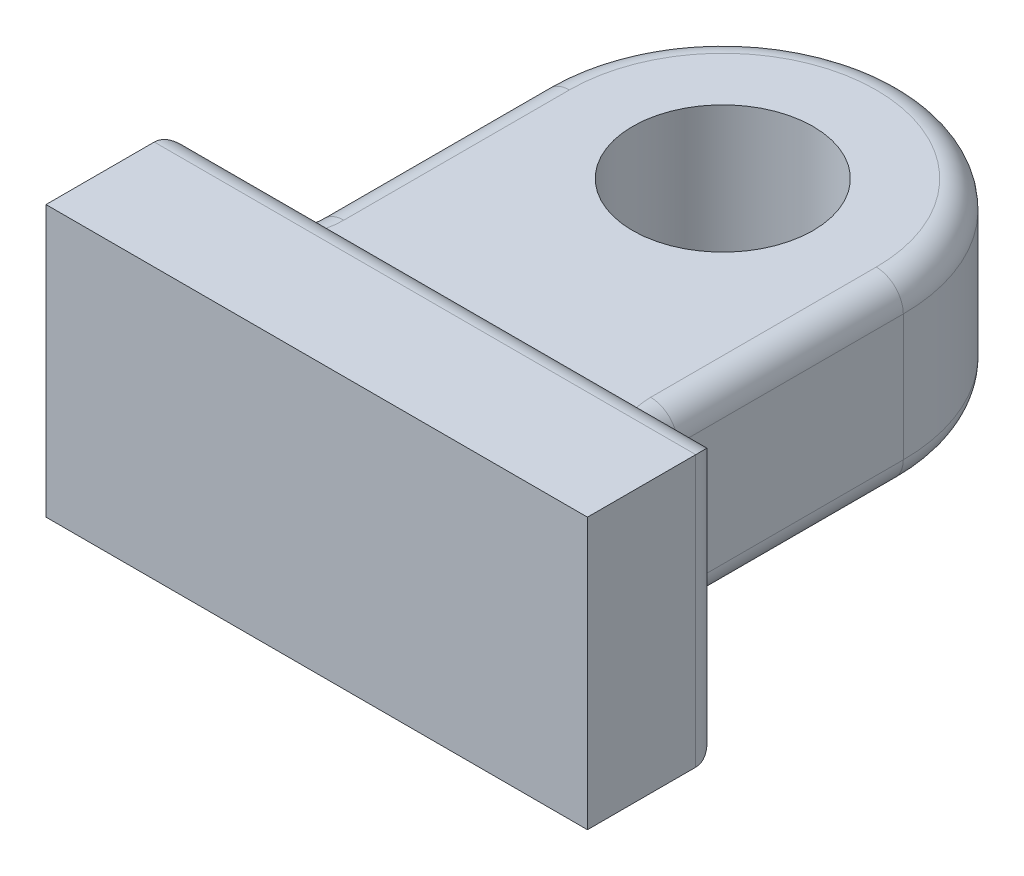
ISO-10303-21;
HEADER;
FILE_DESCRIPTION(('STEP AP214'),'2;1');
FILE_NAME('part.step','',(''),(''),'','','');
FILE_SCHEMA(('AUTOMOTIVE_DESIGN { 1 0 10303 214 1 1 1 1 }'));
ENDSEC;
DATA;
#1=APPLICATION_CONTEXT('core data for automotive mechanical design processes');
#2=APPLICATION_PROTOCOL_DEFINITION('international standard','automotive_design',2000,#1);
#3=PRODUCT_CONTEXT('',#1,'mechanical');
#4=PRODUCT('Part','Part','',(#3));
#5=PRODUCT_RELATED_PRODUCT_CATEGORY('part','',(#4));
#6=PRODUCT_DEFINITION_FORMATION('','',#4);
#7=PRODUCT_DEFINITION_CONTEXT('part definition',#1,'design');
#8=PRODUCT_DEFINITION('design','',#6,#7);
#9=PRODUCT_DEFINITION_SHAPE('','',#8);
#10=(LENGTH_UNIT() NAMED_UNIT(*) SI_UNIT(.MILLI.,.METRE.));
#11=(NAMED_UNIT(*) PLANE_ANGLE_UNIT() SI_UNIT($,.RADIAN.));
#12=(NAMED_UNIT(*) SI_UNIT($,.STERADIAN.) SOLID_ANGLE_UNIT());
#13=UNCERTAINTY_MEASURE_WITH_UNIT(LENGTH_MEASURE(1.E-05),#10,'distance_accuracy_value','');
#14=(GEOMETRIC_REPRESENTATION_CONTEXT(3) GLOBAL_UNCERTAINTY_ASSIGNED_CONTEXT((#13)) GLOBAL_UNIT_ASSIGNED_CONTEXT((#10,
#11,#12)) REPRESENTATION_CONTEXT('',''));
#15=CARTESIAN_POINT('',(0.,0.,0.));
#16=DIRECTION('',(0.,0.,1.));
#17=DIRECTION('',(1.,0.,0.));
#18=AXIS2_PLACEMENT_3D('',#15,#16,#17);
#19=CARTESIAN_POINT('',(30.,15.,15.));
#20=DIRECTION('',(-1.,0.,0.));
#21=DIRECTION('',(0.,-1.,0.));
#22=AXIS2_PLACEMENT_3D('',#19,#20,#21);
#23=PLANE('',#22);
#24=DIRECTION('',(0.,0.,-1.));
#25=VECTOR('',#24,1.);
#26=CARTESIAN_POINT('',(30.,-15.,15.));
#27=LINE('',#26,#25);
#28=CARTESIAN_POINT('',(30.,-15.,15.));
#29=VERTEX_POINT('',#28);
#30=CARTESIAN_POINT('',(30.,-15.,3.));
#31=VERTEX_POINT('',#30);
#32=EDGE_CURVE('E393',#29,#31,#27,.T.);
#33=ORIENTED_EDGE('',*,*,#32,.T.);
#34=DIRECTION('',(0.,1.,0.));
#35=VECTOR('',#34,1.);
#36=CARTESIAN_POINT('',(30.,15.,3.));
#37=LINE('',#36,#35);
#38=CARTESIAN_POINT('',(30.,15.,3.));
#39=VERTEX_POINT('',#38);
#40=EDGE_CURVE('E60',#31,#39,#37,.T.);
#41=ORIENTED_EDGE('',*,*,#40,.T.);
#42=DIRECTION('',(0.,0.,-1.));
#43=VECTOR('',#42,1.);
#44=CARTESIAN_POINT('',(30.,15.,15.));
#45=LINE('',#44,#43);
#46=CARTESIAN_POINT('',(30.,15.,15.));
#47=VERTEX_POINT('',#46);
#48=EDGE_CURVE('E164',#47,#39,#45,.T.);
#49=ORIENTED_EDGE('',*,*,#48,.F.);
#50=DIRECTION('',(0.,1.,0.));
#51=VECTOR('',#50,1.);
#52=CARTESIAN_POINT('',(30.,15.,15.));
#53=LINE('',#52,#51);
#54=EDGE_CURVE('E169',#29,#47,#53,.T.);
#55=ORIENTED_EDGE('',*,*,#54,.F.);
#56=EDGE_LOOP('',(#33,#41,#49,#55));
#57=FACE_BOUND('',#56,.T.);
#58=ADVANCED_FACE('F35',(#57),#23,.F.);
#59=CARTESIAN_POINT('',(-30.,15.,15.));
#60=DIRECTION('',(0.,-1.,0.));
#61=DIRECTION('',(0.,0.,-1.));
#62=AXIS2_PLACEMENT_3D('',#59,#60,#61);
#63=PLANE('',#62);
#64=ORIENTED_EDGE('',*,*,#48,.T.);
#65=DIRECTION('',(-1.,0.,0.));
#66=VECTOR('',#65,1.);
#67=CARTESIAN_POINT('',(-30.,15.,3.));
#68=LINE('',#67,#66);
#69=CARTESIAN_POINT('',(-30.,15.,3.));
#70=VERTEX_POINT('',#69);
#71=EDGE_CURVE('E52',#39,#70,#68,.T.);
#72=ORIENTED_EDGE('',*,*,#71,.T.);
#73=DIRECTION('',(0.,0.,-1.));
#74=VECTOR('',#73,1.);
#75=CARTESIAN_POINT('',(-30.,15.,15.));
#76=LINE('',#75,#74);
#77=CARTESIAN_POINT('',(-30.,15.,15.));
#78=VERTEX_POINT('',#77);
#79=EDGE_CURVE('E165',#78,#70,#76,.T.);
#80=ORIENTED_EDGE('',*,*,#79,.F.);
#81=DIRECTION('',(-1.,0.,0.));
#82=VECTOR('',#81,1.);
#83=CARTESIAN_POINT('',(-30.,15.,15.));
#84=LINE('',#83,#82);
#85=EDGE_CURVE('E161',#47,#78,#84,.T.);
#86=ORIENTED_EDGE('',*,*,#85,.F.);
#87=EDGE_LOOP('',(#64,#72,#80,#86));
#88=FACE_BOUND('',#87,.T.);
#89=ADVANCED_FACE('F163',(#88),#63,.F.);
#90=CARTESIAN_POINT('',(-30.,15.,15.));
#91=DIRECTION('',(1.,0.,0.));
#92=DIRECTION('',(0.,1.,0.));
#93=AXIS2_PLACEMENT_3D('',#90,#91,#92);
#94=PLANE('',#93);
#95=ORIENTED_EDGE('',*,*,#79,.T.);
#96=DIRECTION('',(0.,-1.,0.));
#97=VECTOR('',#96,1.);
#98=CARTESIAN_POINT('',(-30.,15.,3.));
#99=LINE('',#98,#97);
#100=CARTESIAN_POINT('',(-30.,-15.,3.));
#101=VERTEX_POINT('',#100);
#102=EDGE_CURVE('E251',#70,#101,#99,.T.);
#103=ORIENTED_EDGE('',*,*,#102,.T.);
#104=DIRECTION('',(0.,0.,-1.));
#105=VECTOR('',#104,1.);
#106=CARTESIAN_POINT('',(-30.,-15.,15.));
#107=LINE('',#106,#105);
#108=CARTESIAN_POINT('',(-30.,-15.,15.));
#109=VERTEX_POINT('',#108);
#110=EDGE_CURVE('E183',#109,#101,#107,.T.);
#111=ORIENTED_EDGE('',*,*,#110,.F.);
#112=DIRECTION('',(0.,-1.,0.));
#113=VECTOR('',#112,1.);
#114=CARTESIAN_POINT('',(-30.,15.,15.));
#115=LINE('',#114,#113);
#116=EDGE_CURVE('E168',#78,#109,#115,.T.);
#117=ORIENTED_EDGE('',*,*,#116,.F.);
#118=EDGE_LOOP('',(#95,#103,#111,#117));
#119=FACE_BOUND('',#118,.T.);
#120=ADVANCED_FACE('F340',(#119),#94,.F.);
#121=CARTESIAN_POINT('',(-30.,-15.,15.));
#122=DIRECTION('',(0.,1.,0.));
#123=DIRECTION('',(0.,0.,1.));
#124=AXIS2_PLACEMENT_3D('',#121,#122,#123);
#125=PLANE('',#124);
#126=ORIENTED_EDGE('',*,*,#110,.T.);
#127=DIRECTION('',(1.,0.,0.));
#128=VECTOR('',#127,1.);
#129=CARTESIAN_POINT('',(-30.,-15.,3.));
#130=LINE('',#129,#128);
#131=EDGE_CURVE('E237',#101,#31,#130,.T.);
#132=ORIENTED_EDGE('',*,*,#131,.T.);
#133=ORIENTED_EDGE('',*,*,#32,.F.);
#134=DIRECTION('',(1.,0.,0.));
#135=VECTOR('',#134,1.);
#136=CARTESIAN_POINT('',(-30.,-15.,15.));
#137=LINE('',#136,#135);
#138=EDGE_CURVE('E174',#109,#29,#137,.T.);
#139=ORIENTED_EDGE('',*,*,#138,.F.);
#140=EDGE_LOOP('',(#126,#132,#133,#139));
#141=FACE_BOUND('',#140,.T.);
#142=ADVANCED_FACE('F280',(#141),#125,.F.);
#143=CARTESIAN_POINT('',(0.,0.,15.));
#144=DIRECTION('',(0.,0.,1.));
#145=DIRECTION('',(1.,0.,0.));
#146=AXIS2_PLACEMENT_3D('',#143,#144,#145);
#147=PLANE('',#146);
#148=ORIENTED_EDGE('',*,*,#54,.T.);
#149=ORIENTED_EDGE('',*,*,#85,.T.);
#150=ORIENTED_EDGE('',*,*,#116,.T.);
#151=ORIENTED_EDGE('',*,*,#138,.T.);
#152=EDGE_LOOP('',(#148,#149,#150,#151));
#153=FACE_BOUND('',#152,.T.);
#154=ADVANCED_FACE('F172',(#153),#147,.T.);
#155=CARTESIAN_POINT('',(0.,0.,0.));
#156=DIRECTION('',(0.,0.,1.));
#157=DIRECTION('',(1.,0.,0.));
#158=AXIS2_PLACEMENT_3D('',#155,#156,#157);
#159=PLANE('',#158);
#160=DIRECTION('',(0.,1.,0.));
#161=VECTOR('',#160,1.);
#162=CARTESIAN_POINT('',(27.,0.,0.));
#163=LINE('',#162,#161);
#164=CARTESIAN_POINT('',(27.,12.,0.));
#165=VERTEX_POINT('',#164);
#166=CARTESIAN_POINT('',(27.,-12.,0.));
#167=VERTEX_POINT('',#166);
#168=EDGE_CURVE('E244',#165,#167,#163,.F.);
#169=ORIENTED_EDGE('',*,*,#168,.T.);
#170=DIRECTION('',(1.,0.,0.));
#171=VECTOR('',#170,1.);
#172=CARTESIAN_POINT('',(0.,-12.,0.));
#173=LINE('',#172,#171);
#174=CARTESIAN_POINT('',(-27.,-12.,0.));
#175=VERTEX_POINT('',#174);
#176=EDGE_CURVE('E246',#167,#175,#173,.F.);
#177=ORIENTED_EDGE('',*,*,#176,.T.);
#178=DIRECTION('',(0.,-1.,0.));
#179=VECTOR('',#178,1.);
#180=CARTESIAN_POINT('',(-27.,0.,0.));
#181=LINE('',#180,#179);
#182=CARTESIAN_POINT('',(-27.,12.,0.));
#183=VERTEX_POINT('',#182);
#184=EDGE_CURVE('E240',#175,#183,#181,.F.);
#185=ORIENTED_EDGE('',*,*,#184,.T.);
#186=DIRECTION('',(-1.,0.,0.));
#187=VECTOR('',#186,1.);
#188=CARTESIAN_POINT('',(0.,12.,0.));
#189=LINE('',#188,#187);
#190=EDGE_CURVE('E242',#183,#165,#189,.F.);
#191=ORIENTED_EDGE('',*,*,#190,.T.);
#192=EDGE_LOOP('',(#169,#177,#185,#191));
#193=FACE_BOUND('',#192,.T.);
#194=DIRECTION('',(0.,-1.,0.));
#195=VECTOR('',#194,1.);
#196=CARTESIAN_POINT('',(-25.,-10.,0.));
#197=LINE('',#196,#195);
#198=CARTESIAN_POINT('',(-25.,7.,0.));
#199=VERTEX_POINT('',#198);
#200=CARTESIAN_POINT('',(-25.,-7.,0.));
#201=VERTEX_POINT('',#200);
#202=EDGE_CURVE('E181',#199,#201,#197,.T.);
#203=ORIENTED_EDGE('',*,*,#202,.T.);
#204=CARTESIAN_POINT('',(-18.7550020016016,-10.,0.));
#205=CARTESIAN_POINT('',(-18.9164733841713,-9.99999654095699,0.));
#206=CARTESIAN_POINT('',(-19.0777738078066,-9.99205944211911,0.));
#207=CARTESIAN_POINT('',(-19.3987292487778,-9.96181979832402,0.));
#208=CARTESIAN_POINT('',(-19.558386838615,-9.93954497580904,0.));
#209=CARTESIAN_POINT('',(-20.0293676003063,-9.85422569558161,0.));
#210=CARTESIAN_POINT('',(-20.3373438597152,-9.77259683888004,0.));
#211=CARTESIAN_POINT('',(-21.1328055278626,-9.5054406683455,0.));
#212=CARTESIAN_POINT('',(-21.6089019148868,-9.2868538993345,0.));
#213=CARTESIAN_POINT('',(-22.2965822152597,-8.91045124681957,0.));
#214=CARTESIAN_POINT('',(-22.5222520963524,-8.77625749662047,0.));
#215=CARTESIAN_POINT('',(-22.9659746417562,-8.49575532872363,0.));
#216=CARTESIAN_POINT('',(-23.1840285386319,-8.34944888437293,0.));
#217=CARTESIAN_POINT('',(-23.6707114126426,-8.00909265697929,0.));
#218=CARTESIAN_POINT('',(-23.9375928847987,-7.81259085142028,0.));
#219=CARTESIAN_POINT('',(-24.4659288696678,-7.41361765790933,0.));
#220=CARTESIAN_POINT('',(-24.7273933129951,-7.21115921929222,0.));
#221=CARTESIAN_POINT('',(-24.9925464408454,-7.00577350188867,0.));
#222=CARTESIAN_POINT('',(-24.9962732208229,-7.00288675052309,0.));
#223=CARTESIAN_POINT('',(-25.,-7.,0.));
#224=B_SPLINE_CURVE_WITH_KNOTS('',3,(#204,#205,#206,#207,#208,#209,#210,#211,#212,#213,#214,
#215,#216,#217,#218,#219,#220,#221,#222,#223),.UNSPECIFIED.,.F.,.F.,(4,2,2,2,2,2,2,2,2,4),(0.,
0.483954776471207,0.966976610551552,1.9192640156083,3.48158173013985,4.26910349001907,
5.05649720182638,6.05055942430137,7.04260056930054,7.05674270492427),.UNSPECIFIED.);
#225=CARTESIAN_POINT('',(-18.7550020016016,-10.,0.));
#226=VERTEX_POINT('',#225);
#227=EDGE_CURVE('E11',#201,#226,#224,.F.);
#228=ORIENTED_EDGE('',*,*,#227,.T.);
#229=DIRECTION('',(1.,0.,0.));
#230=VECTOR('',#229,1.);
#231=CARTESIAN_POINT('',(-20.,-10.,0.));
#232=LINE('',#231,#230);
#233=CARTESIAN_POINT('',(18.7550020016016,-10.,0.));
#234=VERTEX_POINT('',#233);
#235=EDGE_CURVE('E445',#226,#234,#232,.T.);
#236=ORIENTED_EDGE('',*,*,#235,.T.);
#237=CARTESIAN_POINT('',(18.7550020016016,-10.,0.));
#238=CARTESIAN_POINT('',(18.9164733841713,-9.99999654095699,0.));
#239=CARTESIAN_POINT('',(19.0777738078066,-9.99205944211911,0.));
#240=CARTESIAN_POINT('',(19.3987292487778,-9.96181979832402,0.));
#241=CARTESIAN_POINT('',(19.5583868386149,-9.93954497580905,0.));
#242=CARTESIAN_POINT('',(20.0293676003062,-9.85422569558162,0.));
#243=CARTESIAN_POINT('',(20.3373438597152,-9.77259683888004,0.));
#244=CARTESIAN_POINT('',(21.1328055278626,-9.50544066834549,0.));
#245=CARTESIAN_POINT('',(21.6089019148868,-9.28685389933449,0.));
#246=CARTESIAN_POINT('',(22.2965822152597,-8.91045124681956,0.));
#247=CARTESIAN_POINT('',(22.5222520963524,-8.77625749662047,0.));
#248=CARTESIAN_POINT('',(22.9659746417562,-8.49575532872361,0.));
#249=CARTESIAN_POINT('',(23.1840285386319,-8.34944888437291,0.));
#250=CARTESIAN_POINT('',(23.6707114126426,-8.00909265697931,0.));
#251=CARTESIAN_POINT('',(23.9375928847988,-7.81259085142036,0.));
#252=CARTESIAN_POINT('',(24.4659288696677,-7.41361765790925,0.));
#253=CARTESIAN_POINT('',(24.7273933129948,-7.21115921929194,0.));
#254=CARTESIAN_POINT('',(24.9925464408454,-7.00577350188867,0.));
#255=CARTESIAN_POINT('',(24.9962732208228,-7.00288675052308,0.));
#256=CARTESIAN_POINT('',(25.,-7.,0.));
#257=B_SPLINE_CURVE_WITH_KNOTS('',3,(#237,#238,#239,#240,#241,#242,#243,#244,#245,#246,#247,
#248,#249,#250,#251,#252,#253,#254,#255,#256),.UNSPECIFIED.,.F.,.F.,(4,2,2,2,2,2,2,2,2,4),(0.,
0.48395477647119,0.966976610551517,1.9192640156083,3.48158173013989,4.26910349001909,
5.05649720182638,6.05055942430138,7.04260056930054,7.05674270492428),.UNSPECIFIED.);
#258=CARTESIAN_POINT('',(25.,-7.,0.));
#259=VERTEX_POINT('',#258);
#260=EDGE_CURVE('E44',#234,#259,#257,.T.);
#261=ORIENTED_EDGE('',*,*,#260,.T.);
#262=DIRECTION('',(0.,-1.,0.));
#263=VECTOR('',#262,1.);
#264=CARTESIAN_POINT('',(25.,10.,0.));
#265=LINE('',#264,#263);
#266=CARTESIAN_POINT('',(25.,7.,0.));
#267=VERTEX_POINT('',#266);
#268=EDGE_CURVE('E189',#259,#267,#265,.F.);
#269=ORIENTED_EDGE('',*,*,#268,.T.);
#270=CARTESIAN_POINT('',(18.7550020016016,10.,0.));
#271=CARTESIAN_POINT('',(18.9164733841713,9.99999654095699,0.));
#272=CARTESIAN_POINT('',(19.0777738078066,9.99205944211911,0.));
#273=CARTESIAN_POINT('',(19.3987292487778,9.96181979832402,0.));
#274=CARTESIAN_POINT('',(19.5583868386149,9.93954497580905,0.));
#275=CARTESIAN_POINT('',(20.0293676003062,9.85422569558162,0.));
#276=CARTESIAN_POINT('',(20.3373438597152,9.77259683888004,0.));
#277=CARTESIAN_POINT('',(21.1328055278626,9.50544066834549,0.));
#278=CARTESIAN_POINT('',(21.6089019148868,9.28685389933449,0.));
#279=CARTESIAN_POINT('',(22.2965822152597,8.91045124681956,0.));
#280=CARTESIAN_POINT('',(22.5222520963524,8.77625749662046,0.));
#281=CARTESIAN_POINT('',(22.9659746417562,8.49575532872361,0.));
#282=CARTESIAN_POINT('',(23.1840285386319,8.34944888437292,0.));
#283=CARTESIAN_POINT('',(23.6707114126426,8.0090926569793,0.));
#284=CARTESIAN_POINT('',(23.9375928847988,7.81259085142033,0.));
#285=CARTESIAN_POINT('',(24.4659288696677,7.41361765790928,0.));
#286=CARTESIAN_POINT('',(24.7273933129949,7.21115921929204,0.));
#287=CARTESIAN_POINT('',(24.9925464408454,7.00577350188867,0.));
#288=CARTESIAN_POINT('',(24.9962732208228,7.00288675052308,0.));
#289=CARTESIAN_POINT('',(25.,7.,0.));
#290=B_SPLINE_CURVE_WITH_KNOTS('',3,(#270,#271,#272,#273,#274,#275,#276,#277,#278,#279,#280,
#281,#282,#283,#284,#285,#286,#287,#288,#289),.UNSPECIFIED.,.F.,.F.,(4,2,2,2,2,2,2,2,2,4),(0.,
0.483954776471197,0.966976610551527,1.9192640156083,3.48158173013988,4.26910349001909,
5.05649720182639,6.05055942430138,7.04260056930054,7.05674270492428),.UNSPECIFIED.);
#291=CARTESIAN_POINT('',(18.7550020016016,10.,0.));
#292=VERTEX_POINT('',#291);
#293=EDGE_CURVE('E253',#267,#292,#290,.F.);
#294=ORIENTED_EDGE('',*,*,#293,.T.);
#295=DIRECTION('',(1.,0.,0.));
#296=VECTOR('',#295,1.);
#297=CARTESIAN_POINT('',(-20.,10.,0.));
#298=LINE('',#297,#296);
#299=CARTESIAN_POINT('',(-18.7550020016016,10.,0.));
#300=VERTEX_POINT('',#299);
#301=EDGE_CURVE('E387',#300,#292,#298,.T.);
#302=ORIENTED_EDGE('',*,*,#301,.F.);
#303=CARTESIAN_POINT('',(-18.7550020016016,10.,0.));
#304=CARTESIAN_POINT('',(-18.9164733841713,9.99999654095699,0.));
#305=CARTESIAN_POINT('',(-19.0777738078066,9.99205944211911,0.));
#306=CARTESIAN_POINT('',(-19.3987292487778,9.96181979832402,0.));
#307=CARTESIAN_POINT('',(-19.558386838615,9.93954497580904,0.));
#308=CARTESIAN_POINT('',(-20.0293676003063,9.85422569558161,0.));
#309=CARTESIAN_POINT('',(-20.3373438597152,9.77259683888004,0.));
#310=CARTESIAN_POINT('',(-21.1328055278626,9.5054406683455,0.));
#311=CARTESIAN_POINT('',(-21.6089019148868,9.2868538993345,0.));
#312=CARTESIAN_POINT('',(-22.2965822152597,8.91045124681957,0.));
#313=CARTESIAN_POINT('',(-22.5222520963524,8.77625749662047,0.));
#314=CARTESIAN_POINT('',(-22.9659746417562,8.49575532872363,0.));
#315=CARTESIAN_POINT('',(-23.1840285386319,8.34944888437293,0.));
#316=CARTESIAN_POINT('',(-23.6707114126426,8.00909265697929,0.));
#317=CARTESIAN_POINT('',(-23.9375928847987,7.81259085142028,0.));
#318=CARTESIAN_POINT('',(-24.4659288696678,7.41361765790933,0.));
#319=CARTESIAN_POINT('',(-24.7273933129951,7.21115921929222,0.));
#320=CARTESIAN_POINT('',(-24.9925464408454,7.00577350188867,0.));
#321=CARTESIAN_POINT('',(-24.9962732208229,7.00288675052309,0.));
#322=CARTESIAN_POINT('',(-25.,7.,0.));
#323=B_SPLINE_CURVE_WITH_KNOTS('',3,(#303,#304,#305,#306,#307,#308,#309,#310,#311,#312,#313,
#314,#315,#316,#317,#318,#319,#320,#321,#322),.UNSPECIFIED.,.F.,.F.,(4,2,2,2,2,2,2,2,2,4),(0.,
0.483954776471207,0.966976610551552,1.9192640156083,3.48158173013985,4.26910349001907,
5.05649720182638,6.05055942430137,7.04260056930054,7.05674270492427),.UNSPECIFIED.);
#324=EDGE_CURVE('E261',#300,#199,#323,.T.);
#325=ORIENTED_EDGE('',*,*,#324,.T.);
#326=EDGE_LOOP('',(#203,#228,#236,#261,#269,#294,#302,#325));
#327=FACE_BOUND('',#326,.T.);
#328=ADVANCED_FACE('F272',(#193,#327),#159,.F.);
#329=CARTESIAN_POINT('',(0.,10.,-30.));
#330=DIRECTION('',(0.,1.,0.));
#331=DIRECTION('',(0.,0.,1.));
#332=AXIS2_PLACEMENT_3D('',#329,#330,#331);
#333=PLANE('',#332);
#334=ORIENTED_EDGE('',*,*,#301,.T.);
#335=CARTESIAN_POINT('',(25.,10.,-5.));
#336=DIRECTION('',(0.,1.,0.));
#337=DIRECTION('',(0.,0.,1.));
#338=AXIS2_PLACEMENT_3D('',#335,#336,#337);
#339=CIRCLE('',#338,8.);
#340=CARTESIAN_POINT('',(17.,10.,-5.));
#341=VERTEX_POINT('',#340);
#342=EDGE_CURVE('E203',#292,#341,#339,.F.);
#343=ORIENTED_EDGE('',*,*,#342,.T.);
#344=DIRECTION('',(0.,0.,-1.));
#345=VECTOR('',#344,1.);
#346=CARTESIAN_POINT('',(17.,10.,-30.));
#347=LINE('',#346,#345);
#348=CARTESIAN_POINT('',(17.,10.,-30.));
#349=VERTEX_POINT('',#348);
#350=EDGE_CURVE('E201',#341,#349,#347,.T.);
#351=ORIENTED_EDGE('',*,*,#350,.T.);
#352=CARTESIAN_POINT('',(0.,10.,-30.));
#353=DIRECTION('',(0.,1.,0.));
#354=DIRECTION('',(0.,0.,1.));
#355=AXIS2_PLACEMENT_3D('',#352,#353,#354);
#356=CIRCLE('',#355,17.);
#357=CARTESIAN_POINT('',(-17.,10.,-30.));
#358=VERTEX_POINT('',#357);
#359=EDGE_CURVE('E195',#349,#358,#356,.T.);
#360=ORIENTED_EDGE('',*,*,#359,.T.);
#361=DIRECTION('',(0.,0.,1.));
#362=VECTOR('',#361,1.);
#363=CARTESIAN_POINT('',(-17.,10.,-5.));
#364=LINE('',#363,#362);
#365=CARTESIAN_POINT('',(-17.,10.,-5.));
#366=VERTEX_POINT('',#365);
#367=EDGE_CURVE('E197',#358,#366,#364,.T.);
#368=ORIENTED_EDGE('',*,*,#367,.T.);
#369=CARTESIAN_POINT('',(-25.,10.,-5.));
#370=DIRECTION('',(0.,1.,0.));
#371=DIRECTION('',(0.,0.,1.));
#372=AXIS2_PLACEMENT_3D('',#369,#370,#371);
#373=CIRCLE('',#372,8.);
#374=EDGE_CURVE('E199',#366,#300,#373,.F.);
#375=ORIENTED_EDGE('',*,*,#374,.T.);
#376=EDGE_LOOP('',(#334,#343,#351,#360,#368,#375));
#377=FACE_BOUND('',#376,.T.);
#378=CARTESIAN_POINT('',(0.,10.,-30.));
#379=DIRECTION('',(0.,1.,0.));
#380=DIRECTION('',(0.,0.,1.));
#381=AXIS2_PLACEMENT_3D('',#378,#379,#380);
#382=CIRCLE('',#381,10.);
#383=CARTESIAN_POINT('',(0.,10.,-20.));
#384=VERTEX_POINT('',#383);
#385=EDGE_CURVE('E448',#384,#384,#382,.T.);
#386=ORIENTED_EDGE('',*,*,#385,.F.);
#387=EDGE_LOOP('',(#386));
#388=FACE_BOUND('',#387,.T.);
#389=ADVANCED_FACE('F277',(#377,#388),#333,.T.);
#390=CARTESIAN_POINT('',(0.,-10.,-30.));
#391=DIRECTION('',(0.,1.,0.));
#392=DIRECTION('',(0.,0.,1.));
#393=AXIS2_PLACEMENT_3D('',#390,#391,#392);
#394=PLANE('',#393);
#395=DIRECTION('',(0.,0.,-1.));
#396=VECTOR('',#395,1.);
#397=CARTESIAN_POINT('',(17.,-10.,-30.));
#398=LINE('',#397,#396);
#399=CARTESIAN_POINT('',(17.,-10.,-30.));
#400=VERTEX_POINT('',#399);
#401=CARTESIAN_POINT('',(17.,-10.,-5.));
#402=VERTEX_POINT('',#401);
#403=EDGE_CURVE('E228',#400,#402,#398,.F.);
#404=ORIENTED_EDGE('',*,*,#403,.T.);
#405=CARTESIAN_POINT('',(25.,-10.,-5.));
#406=DIRECTION('',(0.,1.,0.));
#407=DIRECTION('',(0.,0.,1.));
#408=AXIS2_PLACEMENT_3D('',#405,#406,#407);
#409=CIRCLE('',#408,8.);
#410=EDGE_CURVE('E230',#402,#234,#409,.T.);
#411=ORIENTED_EDGE('',*,*,#410,.T.);
#412=ORIENTED_EDGE('',*,*,#235,.F.);
#413=CARTESIAN_POINT('',(-25.,-10.,-5.));
#414=DIRECTION('',(0.,1.,0.));
#415=DIRECTION('',(0.,0.,1.));
#416=AXIS2_PLACEMENT_3D('',#413,#414,#415);
#417=CIRCLE('',#416,8.);
#418=CARTESIAN_POINT('',(-17.,-10.,-5.));
#419=VERTEX_POINT('',#418);
#420=EDGE_CURVE('E226',#226,#419,#417,.T.);
#421=ORIENTED_EDGE('',*,*,#420,.T.);
#422=DIRECTION('',(0.,0.,1.));
#423=VECTOR('',#422,1.);
#424=CARTESIAN_POINT('',(-17.,-10.,-30.));
#425=LINE('',#424,#423);
#426=CARTESIAN_POINT('',(-17.,-10.,-30.));
#427=VERTEX_POINT('',#426);
#428=EDGE_CURVE('E224',#419,#427,#425,.F.);
#429=ORIENTED_EDGE('',*,*,#428,.T.);
#430=CARTESIAN_POINT('',(0.,-10.,-30.));
#431=DIRECTION('',(0.,1.,0.));
#432=DIRECTION('',(0.,0.,1.));
#433=AXIS2_PLACEMENT_3D('',#430,#431,#432);
#434=CIRCLE('',#433,17.);
#435=EDGE_CURVE('E222',#427,#400,#434,.F.);
#436=ORIENTED_EDGE('',*,*,#435,.T.);
#437=EDGE_LOOP('',(#404,#411,#412,#421,#429,#436));
#438=FACE_BOUND('',#437,.T.);
#439=CARTESIAN_POINT('',(0.,-10.,-30.));
#440=DIRECTION('',(0.,1.,0.));
#441=DIRECTION('',(0.,0.,1.));
#442=AXIS2_PLACEMENT_3D('',#439,#440,#441);
#443=CIRCLE('',#442,10.);
#444=CARTESIAN_POINT('',(0.,-10.,-20.));
#445=VERTEX_POINT('',#444);
#446=EDGE_CURVE('E369',#445,#445,#443,.T.);
#447=ORIENTED_EDGE('',*,*,#446,.T.);
#448=EDGE_LOOP('',(#447));
#449=FACE_BOUND('',#448,.T.);
#450=ADVANCED_FACE('F457',(#438,#449),#394,.F.);
#451=CARTESIAN_POINT('',(0.,10.,-30.));
#452=DIRECTION('',(0.,-1.,0.));
#453=DIRECTION('',(0.,0.,-1.));
#454=AXIS2_PLACEMENT_3D('',#451,#452,#453);
#455=CYLINDRICAL_SURFACE('',#454,20.);
#456=DIRECTION('',(0.,-1.,0.));
#457=VECTOR('',#456,1.);
#458=CARTESIAN_POINT('',(-20.,10.,-30.));
#459=LINE('',#458,#457);
#460=CARTESIAN_POINT('',(-20.,7.,-30.));
#461=VERTEX_POINT('',#460);
#462=CARTESIAN_POINT('',(-20.,-7.,-30.));
#463=VERTEX_POINT('',#462);
#464=EDGE_CURVE('E176',#461,#463,#459,.T.);
#465=ORIENTED_EDGE('',*,*,#464,.F.);
#466=CARTESIAN_POINT('',(0.,7.,-30.));
#467=DIRECTION('',(0.,1.,0.));
#468=DIRECTION('',(0.,0.,1.));
#469=AXIS2_PLACEMENT_3D('',#466,#467,#468);
#470=CIRCLE('',#469,20.);
#471=CARTESIAN_POINT('',(20.,7.,-30.));
#472=VERTEX_POINT('',#471);
#473=EDGE_CURVE('E235',#461,#472,#470,.F.);
#474=ORIENTED_EDGE('',*,*,#473,.T.);
#475=DIRECTION('',(0.,-1.,0.));
#476=VECTOR('',#475,1.);
#477=CARTESIAN_POINT('',(20.,10.,-30.));
#478=LINE('',#477,#476);
#479=CARTESIAN_POINT('',(20.,-7.,-30.));
#480=VERTEX_POINT('',#479);
#481=EDGE_CURVE('E385',#472,#480,#478,.T.);
#482=ORIENTED_EDGE('',*,*,#481,.T.);
#483=CARTESIAN_POINT('',(0.,-7.,-30.));
#484=DIRECTION('',(0.,1.,0.));
#485=DIRECTION('',(0.,0.,1.));
#486=AXIS2_PLACEMENT_3D('',#483,#484,#485);
#487=CIRCLE('',#486,20.);
#488=EDGE_CURVE('E233',#480,#463,#487,.T.);
#489=ORIENTED_EDGE('',*,*,#488,.T.);
#490=EDGE_LOOP('',(#465,#474,#482,#489));
#491=FACE_BOUND('',#490,.T.);
#492=ADVANCED_FACE('F381',(#491),#455,.T.);
#493=CARTESIAN_POINT('',(-20.,10.,-30.));
#494=DIRECTION('',(1.,0.,0.));
#495=DIRECTION('',(0.,0.,-1.));
#496=AXIS2_PLACEMENT_3D('',#493,#494,#495);
#497=PLANE('',#496);
#498=DIRECTION('',(0.,-1.,0.));
#499=VECTOR('',#498,1.);
#500=CARTESIAN_POINT('',(-20.,10.,-5.));
#501=LINE('',#500,#499);
#502=CARTESIAN_POINT('',(-20.,-7.,-5.));
#503=VERTEX_POINT('',#502);
#504=CARTESIAN_POINT('',(-20.,7.,-5.));
#505=VERTEX_POINT('',#504);
#506=EDGE_CURVE('E192',#503,#505,#501,.F.);
#507=ORIENTED_EDGE('',*,*,#506,.T.);
#508=DIRECTION('',(0.,0.,1.));
#509=VECTOR('',#508,1.);
#510=CARTESIAN_POINT('',(-20.,7.,-30.));
#511=LINE('',#510,#509);
#512=EDGE_CURVE('E220',#505,#461,#511,.F.);
#513=ORIENTED_EDGE('',*,*,#512,.T.);
#514=ORIENTED_EDGE('',*,*,#464,.T.);
#515=DIRECTION('',(0.,0.,1.));
#516=VECTOR('',#515,1.);
#517=CARTESIAN_POINT('',(-20.,-7.,-30.));
#518=LINE('',#517,#516);
#519=EDGE_CURVE('E218',#463,#503,#518,.T.);
#520=ORIENTED_EDGE('',*,*,#519,.T.);
#521=EDGE_LOOP('',(#507,#513,#514,#520));
#522=FACE_BOUND('',#521,.T.);
#523=ADVANCED_FACE('F378',(#522),#497,.F.);
#524=CARTESIAN_POINT('',(20.,10.,0.));
#525=DIRECTION('',(-1.,0.,0.));
#526=DIRECTION('',(0.,0.,1.));
#527=AXIS2_PLACEMENT_3D('',#524,#525,#526);
#528=PLANE('',#527);
#529=ORIENTED_EDGE('',*,*,#481,.F.);
#530=DIRECTION('',(0.,0.,-1.));
#531=VECTOR('',#530,1.);
#532=CARTESIAN_POINT('',(20.,7.,-5.));
#533=LINE('',#532,#531);
#534=CARTESIAN_POINT('',(20.,7.,-5.));
#535=VERTEX_POINT('',#534);
#536=EDGE_CURVE('E212',#472,#535,#533,.F.);
#537=ORIENTED_EDGE('',*,*,#536,.T.);
#538=DIRECTION('',(0.,-1.,0.));
#539=VECTOR('',#538,1.);
#540=CARTESIAN_POINT('',(20.,-10.,-5.));
#541=LINE('',#540,#539);
#542=CARTESIAN_POINT('',(20.,-7.,-5.));
#543=VERTEX_POINT('',#542);
#544=EDGE_CURVE('E178',#535,#543,#541,.T.);
#545=ORIENTED_EDGE('',*,*,#544,.T.);
#546=DIRECTION('',(0.,0.,-1.));
#547=VECTOR('',#546,1.);
#548=CARTESIAN_POINT('',(20.,-7.,0.));
#549=LINE('',#548,#547);
#550=EDGE_CURVE('E210',#543,#480,#549,.T.);
#551=ORIENTED_EDGE('',*,*,#550,.T.);
#552=EDGE_LOOP('',(#529,#537,#545,#551));
#553=FACE_BOUND('',#552,.T.);
#554=ADVANCED_FACE('F466',(#553),#528,.F.);
#555=CARTESIAN_POINT('',(0.,10.,-30.));
#556=DIRECTION('',(0.,-1.,0.));
#557=DIRECTION('',(0.,0.,-1.));
#558=AXIS2_PLACEMENT_3D('',#555,#556,#557);
#559=CYLINDRICAL_SURFACE('',#558,10.);
#560=ORIENTED_EDGE('',*,*,#385,.T.);
#561=EDGE_LOOP('',(#560));
#562=FACE_BOUND('',#561,.T.);
#563=ORIENTED_EDGE('',*,*,#446,.F.);
#564=EDGE_LOOP('',(#563));
#565=FACE_BOUND('',#564,.T.);
#566=ADVANCED_FACE('F346',(#562,#565),#559,.F.);
#567=CARTESIAN_POINT('',(25.,10.,-5.));
#568=DIRECTION('',(0.,1.,0.));
#569=DIRECTION('',(0.,0.,1.));
#570=AXIS2_PLACEMENT_3D('',#567,#568,#569);
#571=CYLINDRICAL_SURFACE('',#570,5.);
#572=ORIENTED_EDGE('',*,*,#544,.F.);
#573=CARTESIAN_POINT('',(25.,7.,-5.));
#574=DIRECTION('',(0.,1.,0.));
#575=DIRECTION('',(0.,0.,1.));
#576=AXIS2_PLACEMENT_3D('',#573,#574,#575);
#577=CIRCLE('',#576,5.);
#578=EDGE_CURVE('E208',#535,#267,#577,.T.);
#579=ORIENTED_EDGE('',*,*,#578,.T.);
#580=ORIENTED_EDGE('',*,*,#268,.F.);
#581=CARTESIAN_POINT('',(25.,-7.,-5.));
#582=DIRECTION('',(0.,1.,0.));
#583=DIRECTION('',(0.,0.,1.));
#584=AXIS2_PLACEMENT_3D('',#581,#582,#583);
#585=CIRCLE('',#584,5.);
#586=EDGE_CURVE('E206',#259,#543,#585,.F.);
#587=ORIENTED_EDGE('',*,*,#586,.T.);
#588=EDGE_LOOP('',(#572,#579,#580,#587));
#589=FACE_BOUND('',#588,.T.);
#590=ADVANCED_FACE('F343',(#589),#571,.F.);
#591=CARTESIAN_POINT('',(-25.,0.,-5.));
#592=DIRECTION('',(0.,1.,0.));
#593=DIRECTION('',(0.,0.,1.));
#594=AXIS2_PLACEMENT_3D('',#591,#592,#593);
#595=CYLINDRICAL_SURFACE('',#594,5.);
#596=ORIENTED_EDGE('',*,*,#202,.F.);
#597=CARTESIAN_POINT('',(-25.,7.,-5.));
#598=DIRECTION('',(0.,1.,0.));
#599=DIRECTION('',(0.,0.,1.));
#600=AXIS2_PLACEMENT_3D('',#597,#598,#599);
#601=CIRCLE('',#600,5.);
#602=EDGE_CURVE('E216',#199,#505,#601,.T.);
#603=ORIENTED_EDGE('',*,*,#602,.T.);
#604=ORIENTED_EDGE('',*,*,#506,.F.);
#605=CARTESIAN_POINT('',(-25.,-7.,-5.));
#606=DIRECTION('',(0.,1.,0.));
#607=DIRECTION('',(0.,0.,1.));
#608=AXIS2_PLACEMENT_3D('',#605,#606,#607);
#609=CIRCLE('',#608,5.);
#610=EDGE_CURVE('E214',#503,#201,#609,.F.);
#611=ORIENTED_EDGE('',*,*,#610,.T.);
#612=EDGE_LOOP('',(#596,#603,#604,#611));
#613=FACE_BOUND('',#612,.T.);
#614=ADVANCED_FACE('F345',(#613),#595,.F.);
#615=CARTESIAN_POINT('',(-25.,7.,-5.));
#616=DIRECTION('',(0.,1.,0.));
#617=DIRECTION('',(0.,0.,1.));
#618=AXIS2_PLACEMENT_3D('',#615,#616,#617);
#619=TOROIDAL_SURFACE('',#618,8.,3.);
#620=ORIENTED_EDGE('',*,*,#324,.F.);
#621=ORIENTED_EDGE('',*,*,#374,.F.);
#622=CARTESIAN_POINT('',(-17.,7.,-5.));
#623=DIRECTION('',(0.,0.,-1.));
#624=DIRECTION('',(-1.,0.,0.));
#625=AXIS2_PLACEMENT_3D('',#622,#623,#624);
#626=CIRCLE('',#625,3.);
#627=EDGE_CURVE('E365',#505,#366,#626,.T.);
#628=ORIENTED_EDGE('',*,*,#627,.F.);
#629=ORIENTED_EDGE('',*,*,#602,.F.);
#630=EDGE_LOOP('',(#620,#621,#628,#629));
#631=FACE_BOUND('',#630,.T.);
#632=ADVANCED_FACE('F302',(#631),#619,.T.);
#633=CARTESIAN_POINT('',(-17.,7.,-30.));
#634=DIRECTION('',(0.,0.,-1.));
#635=DIRECTION('',(-1.,0.,0.));
#636=AXIS2_PLACEMENT_3D('',#633,#634,#635);
#637=CYLINDRICAL_SURFACE('',#636,3.);
#638=ORIENTED_EDGE('',*,*,#627,.T.);
#639=ORIENTED_EDGE('',*,*,#367,.F.);
#640=CARTESIAN_POINT('',(-17.,7.,-30.));
#641=DIRECTION('',(0.,0.,-1.));
#642=DIRECTION('',(-1.,0.,0.));
#643=AXIS2_PLACEMENT_3D('',#640,#641,#642);
#644=CIRCLE('',#643,3.);
#645=EDGE_CURVE('E370',#461,#358,#644,.T.);
#646=ORIENTED_EDGE('',*,*,#645,.F.);
#647=ORIENTED_EDGE('',*,*,#512,.F.);
#648=EDGE_LOOP('',(#638,#639,#646,#647));
#649=FACE_BOUND('',#648,.T.);
#650=ADVANCED_FACE('F353',(#649),#637,.T.);
#651=CARTESIAN_POINT('',(0.,7.,-30.));
#652=DIRECTION('',(0.,1.,0.));
#653=DIRECTION('',(0.,0.,1.));
#654=AXIS2_PLACEMENT_3D('',#651,#652,#653);
#655=TOROIDAL_SURFACE('',#654,17.,3.);
#656=ORIENTED_EDGE('',*,*,#645,.T.);
#657=ORIENTED_EDGE('',*,*,#359,.F.);
#658=CARTESIAN_POINT('',(17.,7.,-30.));
#659=DIRECTION('',(0.,0.,1.));
#660=DIRECTION('',(1.,0.,0.));
#661=AXIS2_PLACEMENT_3D('',#658,#659,#660);
#662=CIRCLE('',#661,3.);
#663=EDGE_CURVE('E428',#472,#349,#662,.T.);
#664=ORIENTED_EDGE('',*,*,#663,.F.);
#665=ORIENTED_EDGE('',*,*,#473,.F.);
#666=EDGE_LOOP('',(#656,#657,#664,#665));
#667=FACE_BOUND('',#666,.T.);
#668=ADVANCED_FACE('F514',(#667),#655,.T.);
#669=CARTESIAN_POINT('',(17.,7.,-30.));
#670=DIRECTION('',(0.,0.,1.));
#671=DIRECTION('',(1.,0.,0.));
#672=AXIS2_PLACEMENT_3D('',#669,#670,#671);
#673=CYLINDRICAL_SURFACE('',#672,3.);
#674=ORIENTED_EDGE('',*,*,#663,.T.);
#675=ORIENTED_EDGE('',*,*,#350,.F.);
#676=CARTESIAN_POINT('',(17.,7.,-5.));
#677=DIRECTION('',(0.,0.,1.));
#678=DIRECTION('',(0.,-1.,0.));
#679=AXIS2_PLACEMENT_3D('',#676,#677,#678);
#680=CIRCLE('',#679,3.);
#681=EDGE_CURVE('E418',#535,#341,#680,.T.);
#682=ORIENTED_EDGE('',*,*,#681,.F.);
#683=ORIENTED_EDGE('',*,*,#536,.F.);
#684=EDGE_LOOP('',(#674,#675,#682,#683));
#685=FACE_BOUND('',#684,.T.);
#686=ADVANCED_FACE('F438',(#685),#673,.T.);
#687=CARTESIAN_POINT('',(25.,7.,-5.));
#688=DIRECTION('',(0.,1.,0.));
#689=DIRECTION('',(0.,0.,1.));
#690=AXIS2_PLACEMENT_3D('',#687,#688,#689);
#691=TOROIDAL_SURFACE('',#690,8.,3.);
#692=ORIENTED_EDGE('',*,*,#293,.F.);
#693=ORIENTED_EDGE('',*,*,#578,.F.);
#694=ORIENTED_EDGE('',*,*,#681,.T.);
#695=ORIENTED_EDGE('',*,*,#342,.F.);
#696=EDGE_LOOP('',(#692,#693,#694,#695));
#697=FACE_BOUND('',#696,.T.);
#698=ADVANCED_FACE('F268',(#697),#691,.T.);
#699=CARTESIAN_POINT('',(-25.,-7.,-5.));
#700=DIRECTION('',(0.,1.,0.));
#701=DIRECTION('',(0.,0.,1.));
#702=AXIS2_PLACEMENT_3D('',#699,#700,#701);
#703=TOROIDAL_SURFACE('',#702,8.,3.);
#704=ORIENTED_EDGE('',*,*,#227,.F.);
#705=ORIENTED_EDGE('',*,*,#610,.F.);
#706=CARTESIAN_POINT('',(-17.,-7.,-5.));
#707=DIRECTION('',(0.,0.,-1.));
#708=DIRECTION('',(-1.,0.,0.));
#709=AXIS2_PLACEMENT_3D('',#706,#707,#708);
#710=CIRCLE('',#709,3.);
#711=EDGE_CURVE('E415',#419,#503,#710,.T.);
#712=ORIENTED_EDGE('',*,*,#711,.F.);
#713=ORIENTED_EDGE('',*,*,#420,.F.);
#714=EDGE_LOOP('',(#704,#705,#712,#713));
#715=FACE_BOUND('',#714,.T.);
#716=ADVANCED_FACE('F314',(#715),#703,.T.);
#717=CARTESIAN_POINT('',(-17.,-7.,-30.));
#718=DIRECTION('',(0.,0.,1.));
#719=DIRECTION('',(1.,0.,0.));
#720=AXIS2_PLACEMENT_3D('',#717,#718,#719);
#721=CYLINDRICAL_SURFACE('',#720,3.);
#722=ORIENTED_EDGE('',*,*,#711,.T.);
#723=ORIENTED_EDGE('',*,*,#519,.F.);
#724=CARTESIAN_POINT('',(-17.,-7.,-30.));
#725=DIRECTION('',(0.,0.,-1.));
#726=DIRECTION('',(-1.,0.,0.));
#727=AXIS2_PLACEMENT_3D('',#724,#725,#726);
#728=CIRCLE('',#727,3.);
#729=EDGE_CURVE('E419',#427,#463,#728,.T.);
#730=ORIENTED_EDGE('',*,*,#729,.F.);
#731=ORIENTED_EDGE('',*,*,#428,.F.);
#732=EDGE_LOOP('',(#722,#723,#730,#731));
#733=FACE_BOUND('',#732,.T.);
#734=ADVANCED_FACE('F311',(#733),#721,.T.);
#735=CARTESIAN_POINT('',(0.,-7.,-30.));
#736=DIRECTION('',(0.,1.,0.));
#737=DIRECTION('',(0.,0.,1.));
#738=AXIS2_PLACEMENT_3D('',#735,#736,#737);
#739=TOROIDAL_SURFACE('',#738,17.,3.);
#740=ORIENTED_EDGE('',*,*,#729,.T.);
#741=ORIENTED_EDGE('',*,*,#488,.F.);
#742=CARTESIAN_POINT('',(17.,-7.,-30.));
#743=DIRECTION('',(0.,0.,1.));
#744=DIRECTION('',(1.,0.,0.));
#745=AXIS2_PLACEMENT_3D('',#742,#743,#744);
#746=CIRCLE('',#745,3.);
#747=EDGE_CURVE('E422',#400,#480,#746,.T.);
#748=ORIENTED_EDGE('',*,*,#747,.F.);
#749=ORIENTED_EDGE('',*,*,#435,.F.);
#750=EDGE_LOOP('',(#740,#741,#748,#749));
#751=FACE_BOUND('',#750,.T.);
#752=ADVANCED_FACE('F307',(#751),#739,.T.);
#753=CARTESIAN_POINT('',(17.,-7.,0.));
#754=DIRECTION('',(0.,0.,-1.));
#755=DIRECTION('',(-1.,0.,0.));
#756=AXIS2_PLACEMENT_3D('',#753,#754,#755);
#757=CYLINDRICAL_SURFACE('',#756,3.);
#758=ORIENTED_EDGE('',*,*,#747,.T.);
#759=ORIENTED_EDGE('',*,*,#550,.F.);
#760=CARTESIAN_POINT('',(17.,-7.,-5.));
#761=DIRECTION('',(0.,0.,1.));
#762=DIRECTION('',(1.,0.,0.));
#763=AXIS2_PLACEMENT_3D('',#760,#761,#762);
#764=CIRCLE('',#763,3.);
#765=EDGE_CURVE('E413',#402,#543,#764,.T.);
#766=ORIENTED_EDGE('',*,*,#765,.F.);
#767=ORIENTED_EDGE('',*,*,#403,.F.);
#768=EDGE_LOOP('',(#758,#759,#766,#767));
#769=FACE_BOUND('',#768,.T.);
#770=ADVANCED_FACE('F300',(#769),#757,.T.);
#771=CARTESIAN_POINT('',(25.,-7.,-5.));
#772=DIRECTION('',(0.,1.,0.));
#773=DIRECTION('',(0.,0.,1.));
#774=AXIS2_PLACEMENT_3D('',#771,#772,#773);
#775=TOROIDAL_SURFACE('',#774,8.,3.);
#776=ORIENTED_EDGE('',*,*,#765,.T.);
#777=ORIENTED_EDGE('',*,*,#586,.F.);
#778=ORIENTED_EDGE('',*,*,#260,.F.);
#779=ORIENTED_EDGE('',*,*,#410,.F.);
#780=EDGE_LOOP('',(#776,#777,#778,#779));
#781=FACE_BOUND('',#780,.T.);
#782=ADVANCED_FACE('F296',(#781),#775,.T.);
#783=CARTESIAN_POINT('',(-30.,12.,3.));
#784=DIRECTION('',(-1.,0.,0.));
#785=DIRECTION('',(0.,0.,1.));
#786=AXIS2_PLACEMENT_3D('',#783,#784,#785);
#787=CYLINDRICAL_SURFACE('',#786,3.);
#788=CARTESIAN_POINT('',(27.,12.,3.));
#789=DIRECTION('',(-0.707106781186548,0.707106781186547,0.));
#790=DIRECTION('',(-0.707106781186547,-0.707106781186548,0.));
#791=AXIS2_PLACEMENT_3D('',#788,#789,#790);
#792=ELLIPSE('',#791,4.24264068711928,3.);
#793=EDGE_CURVE('E404',#165,#39,#792,.F.);
#794=ORIENTED_EDGE('',*,*,#793,.F.);
#795=ORIENTED_EDGE('',*,*,#190,.F.);
#796=CARTESIAN_POINT('',(-27.,12.,3.));
#797=DIRECTION('',(-0.707106781186547,-0.707106781186548,0.));
#798=DIRECTION('',(0.707106781186548,-0.707106781186547,0.));
#799=AXIS2_PLACEMENT_3D('',#796,#797,#798);
#800=ELLIPSE('',#799,4.24264068711929,3.);
#801=EDGE_CURVE('E39',#70,#183,#800,.T.);
#802=ORIENTED_EDGE('',*,*,#801,.F.);
#803=ORIENTED_EDGE('',*,*,#71,.F.);
#804=EDGE_LOOP('',(#794,#795,#802,#803));
#805=FACE_BOUND('',#804,.T.);
#806=ADVANCED_FACE('F37',(#805),#787,.T.);
#807=CARTESIAN_POINT('',(-27.,15.,3.));
#808=DIRECTION('',(0.,-1.,0.));
#809=DIRECTION('',(1.,0.,0.));
#810=AXIS2_PLACEMENT_3D('',#807,#808,#809);
#811=CYLINDRICAL_SURFACE('',#810,3.);
#812=ORIENTED_EDGE('',*,*,#801,.T.);
#813=ORIENTED_EDGE('',*,*,#184,.F.);
#814=CARTESIAN_POINT('',(-27.,-12.,3.));
#815=DIRECTION('',(0.707106781186548,-0.707106781186547,0.));
#816=DIRECTION('',(-0.707106781186547,-0.707106781186548,0.));
#817=AXIS2_PLACEMENT_3D('',#814,#815,#816);
#818=ELLIPSE('',#817,4.24264068711928,3.);
#819=EDGE_CURVE('E402',#101,#175,#818,.T.);
#820=ORIENTED_EDGE('',*,*,#819,.F.);
#821=ORIENTED_EDGE('',*,*,#102,.F.);
#822=EDGE_LOOP('',(#812,#813,#820,#821));
#823=FACE_BOUND('',#822,.T.);
#824=ADVANCED_FACE('F326',(#823),#811,.T.);
#825=CARTESIAN_POINT('',(27.,15.,3.));
#826=DIRECTION('',(0.,1.,0.));
#827=DIRECTION('',(-1.,0.,0.));
#828=AXIS2_PLACEMENT_3D('',#825,#826,#827);
#829=CYLINDRICAL_SURFACE('',#828,3.);
#830=ORIENTED_EDGE('',*,*,#793,.T.);
#831=ORIENTED_EDGE('',*,*,#40,.F.);
#832=CARTESIAN_POINT('',(27.,-12.,3.));
#833=DIRECTION('',(0.707106781186547,0.707106781186548,0.));
#834=DIRECTION('',(-0.707106781186548,0.707106781186547,0.));
#835=AXIS2_PLACEMENT_3D('',#832,#833,#834);
#836=ELLIPSE('',#835,4.24264068711929,3.);
#837=EDGE_CURVE('E405',#167,#31,#836,.F.);
#838=ORIENTED_EDGE('',*,*,#837,.F.);
#839=ORIENTED_EDGE('',*,*,#168,.F.);
#840=EDGE_LOOP('',(#830,#831,#838,#839));
#841=FACE_BOUND('',#840,.T.);
#842=ADVANCED_FACE('F323',(#841),#829,.T.);
#843=CARTESIAN_POINT('',(-30.,-12.,3.));
#844=DIRECTION('',(1.,0.,0.));
#845=DIRECTION('',(0.,0.,-1.));
#846=AXIS2_PLACEMENT_3D('',#843,#844,#845);
#847=CYLINDRICAL_SURFACE('',#846,3.);
#848=ORIENTED_EDGE('',*,*,#819,.T.);
#849=ORIENTED_EDGE('',*,*,#176,.F.);
#850=ORIENTED_EDGE('',*,*,#837,.T.);
#851=ORIENTED_EDGE('',*,*,#131,.F.);
#852=EDGE_LOOP('',(#848,#849,#850,#851));
#853=FACE_BOUND('',#852,.T.);
#854=ADVANCED_FACE('F320',(#853),#847,.T.);
#855=CLOSED_SHELL('',(#58,#89,#120,#142,#154,#328,#389,#450,#492,#523,#554,#566,#590,#614,#632,
#650,#668,#686,#698,#716,#734,#752,#770,#782,#806,#824,#842,#854));
#856=MANIFOLD_SOLID_BREP('B2',#855);
#857=ADVANCED_BREP_SHAPE_REPRESENTATION('',(#18,#856),#14);
#858=SHAPE_DEFINITION_REPRESENTATION(#9,#857);
ENDSEC;
END-ISO-10303-21;
